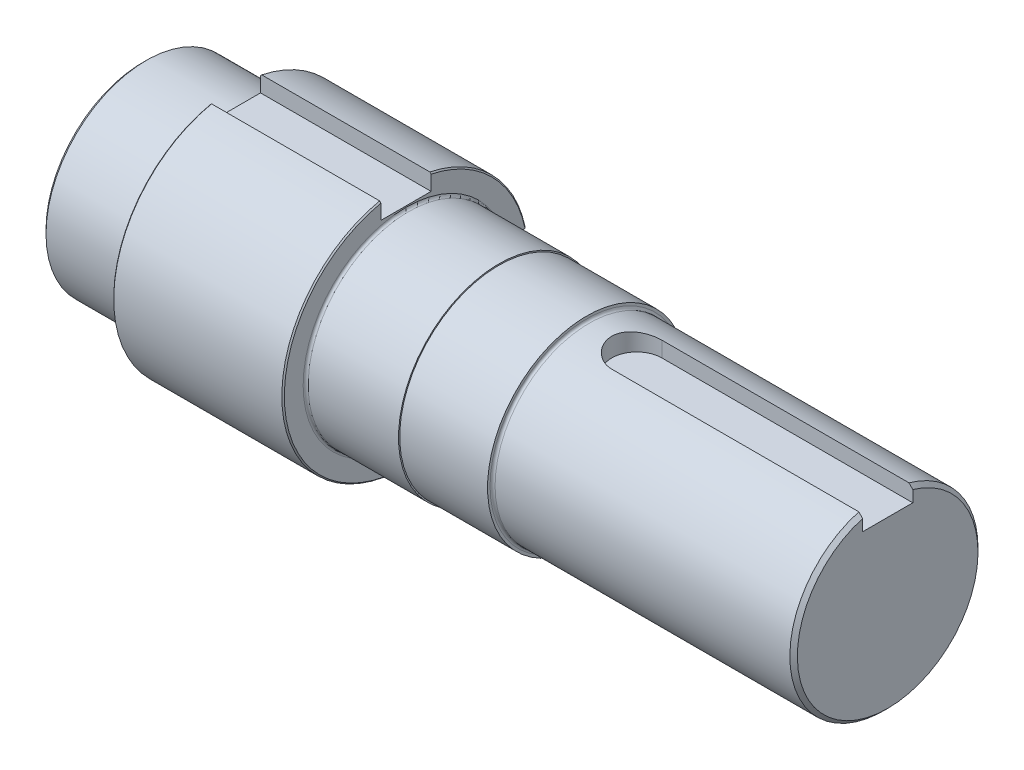
ISO-10303-21;
HEADER;
FILE_DESCRIPTION(('STEP AP214'),'2;1');
FILE_NAME('part.step','',(''),(''),'','','');
FILE_SCHEMA(('AUTOMOTIVE_DESIGN { 1 0 10303 214 1 1 1 1 }'));
ENDSEC;
DATA;
#1=APPLICATION_CONTEXT('core data for automotive mechanical design processes');
#2=APPLICATION_PROTOCOL_DEFINITION('international standard','automotive_design',2000,#1);
#3=PRODUCT_CONTEXT('',#1,'mechanical');
#4=PRODUCT('Part','Part','',(#3));
#5=PRODUCT_RELATED_PRODUCT_CATEGORY('part','',(#4));
#6=PRODUCT_DEFINITION_FORMATION('','',#4);
#7=PRODUCT_DEFINITION_CONTEXT('part definition',#1,'design');
#8=PRODUCT_DEFINITION('design','',#6,#7);
#9=PRODUCT_DEFINITION_SHAPE('','',#8);
#10=(LENGTH_UNIT() NAMED_UNIT(*) SI_UNIT(.MILLI.,.METRE.));
#11=(NAMED_UNIT(*) PLANE_ANGLE_UNIT() SI_UNIT($,.RADIAN.));
#12=(NAMED_UNIT(*) SI_UNIT($,.STERADIAN.) SOLID_ANGLE_UNIT());
#13=UNCERTAINTY_MEASURE_WITH_UNIT(LENGTH_MEASURE(1.E-05),#10,'distance_accuracy_value','');
#14=(GEOMETRIC_REPRESENTATION_CONTEXT(3) GLOBAL_UNCERTAINTY_ASSIGNED_CONTEXT((#13)) GLOBAL_UNIT_ASSIGNED_CONTEXT((#10,
#11,#12)) REPRESENTATION_CONTEXT('',''));
#15=CARTESIAN_POINT('',(0.,0.,0.));
#16=DIRECTION('',(0.,0.,1.));
#17=DIRECTION('',(1.,0.,0.));
#18=AXIS2_PLACEMENT_3D('',#15,#16,#17);
#19=CARTESIAN_POINT('',(0.,0.,0.));
#20=DIRECTION('',(1.,0.,0.));
#21=DIRECTION('',(0.,0.,-1.));
#22=AXIS2_PLACEMENT_3D('',#19,#20,#21);
#23=CYLINDRICAL_SURFACE('',#22,49.);
#24=DIRECTION('',(-1.,0.,0.));
#25=VECTOR('',#24,1.);
#26=CARTESIAN_POINT('',(126.360009363294,47.9687398208458,-10.));
#27=LINE('',#26,#25);
#28=CARTESIAN_POINT('',(104.5,47.9687398208458,-10.));
#29=VERTEX_POINT('',#28);
#30=CARTESIAN_POINT('',(37.5,47.9687398208458,-10.));
#31=VERTEX_POINT('',#30);
#32=EDGE_CURVE('E246',#29,#31,#27,.T.);
#33=ORIENTED_EDGE('',*,*,#32,.F.);
#34=CARTESIAN_POINT('',(104.5,0.,0.));
#35=DIRECTION('',(1.,0.,0.));
#36=DIRECTION('',(0.,0.,-1.));
#37=AXIS2_PLACEMENT_3D('',#34,#35,#36);
#38=CIRCLE('',#37,49.);
#39=CARTESIAN_POINT('',(104.5,10.,-47.9687398208458));
#40=VERTEX_POINT('',#39);
#41=EDGE_CURVE('E399',#29,#40,#38,.F.);
#42=ORIENTED_EDGE('',*,*,#41,.T.);
#43=DIRECTION('',(-1.,0.,0.));
#44=VECTOR('',#43,1.);
#45=CARTESIAN_POINT('',(126.360009363294,10.,-47.9687398208458));
#46=LINE('',#45,#44);
#47=CARTESIAN_POINT('',(37.5,10.,-47.9687398208458));
#48=VERTEX_POINT('',#47);
#49=EDGE_CURVE('E211',#40,#48,#46,.T.);
#50=ORIENTED_EDGE('',*,*,#49,.T.);
#51=CARTESIAN_POINT('',(37.5000000000001,0.,0.));
#52=DIRECTION('',(-1.,0.,0.));
#53=DIRECTION('',(0.,0.,1.));
#54=AXIS2_PLACEMENT_3D('',#51,#52,#53);
#55=CIRCLE('',#54,49.);
#56=EDGE_CURVE('E402',#48,#31,#55,.F.);
#57=ORIENTED_EDGE('',*,*,#56,.T.);
#58=EDGE_LOOP('',(#33,#42,#50,#57));
#59=FACE_BOUND('',#58,.T.);
#60=ADVANCED_FACE('F36',(#59),#23,.T.);
#61=CARTESIAN_POINT('',(0.,0.,0.));
#62=DIRECTION('',(1.,0.,0.));
#63=DIRECTION('',(0.,0.,-1.));
#64=AXIS2_PLACEMENT_3D('',#61,#62,#63);
#65=CYLINDRICAL_SURFACE('',#64,40.);
#66=CARTESIAN_POINT('',(106.,0.,0.));
#67=DIRECTION('',(1.,0.,0.));
#68=DIRECTION('',(0.,0.,-1.));
#69=AXIS2_PLACEMENT_3D('',#66,#67,#68);
#70=CIRCLE('',#69,40.);
#71=CARTESIAN_POINT('',(106.,0.,-40.));
#72=VERTEX_POINT('',#71);
#73=EDGE_CURVE('E267',#72,#72,#70,.T.);
#74=ORIENTED_EDGE('',*,*,#73,.T.);
#75=EDGE_LOOP('',(#74));
#76=FACE_BOUND('',#75,.T.);
#77=CARTESIAN_POINT('',(142.,0.,0.));
#78=DIRECTION('',(1.,0.,0.));
#79=DIRECTION('',(0.,0.,-1.));
#80=AXIS2_PLACEMENT_3D('',#77,#78,#79);
#81=CIRCLE('',#80,40.);
#82=CARTESIAN_POINT('',(142.,0.,-40.));
#83=VERTEX_POINT('',#82);
#84=EDGE_CURVE('E258',#83,#83,#81,.T.);
#85=ORIENTED_EDGE('',*,*,#84,.F.);
#86=EDGE_LOOP('',(#85));
#87=FACE_BOUND('',#86,.T.);
#88=ADVANCED_FACE('F388',(#76,#87),#65,.T.);
#89=CARTESIAN_POINT('',(142.,39.5,0.));
#90=DIRECTION('',(1.,0.,0.));
#91=DIRECTION('',(0.,0.,-1.));
#92=AXIS2_PLACEMENT_3D('',#89,#90,#91);
#93=PLANE('',#92);
#94=ORIENTED_EDGE('',*,*,#84,.T.);
#95=EDGE_LOOP('',(#94));
#96=FACE_BOUND('',#95,.T.);
#97=CARTESIAN_POINT('',(142.,0.,0.));
#98=DIRECTION('',(1.,0.,0.));
#99=DIRECTION('',(0.,0.,-1.));
#100=AXIS2_PLACEMENT_3D('',#97,#98,#99);
#101=CIRCLE('',#100,39.5);
#102=CARTESIAN_POINT('',(142.,0.,-39.5));
#103=VERTEX_POINT('',#102);
#104=EDGE_CURVE('E255',#103,#103,#101,.T.);
#105=ORIENTED_EDGE('',*,*,#104,.F.);
#106=EDGE_LOOP('',(#105));
#107=FACE_BOUND('',#106,.T.);
#108=ADVANCED_FACE('F393',(#96,#107),#93,.T.);
#109=CARTESIAN_POINT('',(0.,0.,0.));
#110=DIRECTION('',(1.,0.,0.));
#111=DIRECTION('',(0.,0.,-1.));
#112=AXIS2_PLACEMENT_3D('',#109,#110,#111);
#113=CYLINDRICAL_SURFACE('',#112,39.5);
#114=ORIENTED_EDGE('',*,*,#104,.T.);
#115=EDGE_LOOP('',(#114));
#116=FACE_BOUND('',#115,.T.);
#117=CARTESIAN_POINT('',(177.,0.,0.));
#118=DIRECTION('',(1.,0.,0.));
#119=DIRECTION('',(0.,0.,-1.));
#120=AXIS2_PLACEMENT_3D('',#117,#118,#119);
#121=CIRCLE('',#120,39.5);
#122=CARTESIAN_POINT('',(177.,0.,-39.5));
#123=VERTEX_POINT('',#122);
#124=EDGE_CURVE('E252',#123,#123,#121,.T.);
#125=ORIENTED_EDGE('',*,*,#124,.F.);
#126=EDGE_LOOP('',(#125));
#127=FACE_BOUND('',#126,.T.);
#128=ADVANCED_FACE('F714',(#116,#127),#113,.T.);
#129=CARTESIAN_POINT('',(177.,37.5,0.));
#130=DIRECTION('',(1.,0.,0.));
#131=DIRECTION('',(0.,0.,-1.));
#132=AXIS2_PLACEMENT_3D('',#129,#130,#131);
#133=PLANE('',#132);
#134=CARTESIAN_POINT('',(177.,0.,0.));
#135=DIRECTION('',(1.,0.,0.));
#136=DIRECTION('',(0.,0.,-1.));
#137=AXIS2_PLACEMENT_3D('',#134,#135,#136);
#138=CIRCLE('',#137,38.5);
#139=CARTESIAN_POINT('',(177.,0.,-38.5));
#140=VERTEX_POINT('',#139);
#141=EDGE_CURVE('E264',#140,#140,#138,.F.);
#142=ORIENTED_EDGE('',*,*,#141,.T.);
#143=EDGE_LOOP('',(#142));
#144=FACE_BOUND('',#143,.T.);
#145=ORIENTED_EDGE('',*,*,#124,.T.);
#146=EDGE_LOOP('',(#145));
#147=FACE_BOUND('',#146,.T.);
#148=ADVANCED_FACE('F385',(#144,#147),#133,.T.);
#149=CARTESIAN_POINT('',(0.,0.,0.));
#150=DIRECTION('',(1.,0.,0.));
#151=DIRECTION('',(0.,0.,-1.));
#152=AXIS2_PLACEMENT_3D('',#149,#150,#151);
#153=CYLINDRICAL_SURFACE('',#152,37.5);
#154=DIRECTION('',(1.,0.,0.));
#155=VECTOR('',#154,1.);
#156=CARTESIAN_POINT('',(0.,36.1420807370024,-9.99999999999996));
#157=LINE('',#156,#155);
#158=CARTESIAN_POINT('',(295.5,36.1420807370024,-9.99999999999996));
#159=VERTEX_POINT('',#158);
#160=CARTESIAN_POINT('',(197.,36.1420807370024,-9.99999999999999));
#161=VERTEX_POINT('',#160);
#162=EDGE_CURVE('E194',#159,#161,#157,.F.);
#163=ORIENTED_EDGE('',*,*,#162,.F.);
#164=CARTESIAN_POINT('',(295.5,0.,0.));
#165=DIRECTION('',(1.,0.,0.));
#166=DIRECTION('',(0.,0.,-1.));
#167=AXIS2_PLACEMENT_3D('',#164,#165,#166);
#168=CIRCLE('',#167,37.5);
#169=CARTESIAN_POINT('',(295.5,36.1420807370024,10.));
#170=VERTEX_POINT('',#169);
#171=EDGE_CURVE('E314',#159,#170,#168,.F.);
#172=ORIENTED_EDGE('',*,*,#171,.T.);
#173=DIRECTION('',(1.,0.,0.));
#174=VECTOR('',#173,1.);
#175=CARTESIAN_POINT('',(0.,36.1420807370024,10.));
#176=LINE('',#175,#174);
#177=CARTESIAN_POINT('',(197.,36.1420807370024,10.));
#178=VERTEX_POINT('',#177);
#179=EDGE_CURVE('E196',#178,#170,#176,.T.);
#180=ORIENTED_EDGE('',*,*,#179,.F.);
#181=CARTESIAN_POINT('',(197.,36.1420807370024,-9.99999999999999));
#182=CARTESIAN_POINT('',(196.724109580161,36.1420464078998,-10.0000357292068));
#183=CARTESIAN_POINT('',(196.448231289096,36.1452385899087,-9.98858427588763));
#184=CARTESIAN_POINT('',(195.89855077144,36.1578258631696,-9.94297036791714));
#185=CARTESIAN_POINT('',(195.624748168825,36.1672198023945,-9.90881213122839));
#186=CARTESIAN_POINT('',(195.081751041847,36.1919340616184,-9.81814538046824));
#187=CARTESIAN_POINT('',(194.812547878144,36.2072416006051,-9.76168506181857));
#188=CARTESIAN_POINT('',(194.280044751028,36.2433115177211,-9.62690315126375));
#189=CARTESIAN_POINT('',(194.016744891385,36.2640739916563,-9.54858117539717));
#190=CARTESIAN_POINT('',(193.497963434292,36.310432607492,-9.37074735142767));
#191=CARTESIAN_POINT('',(193.242478763069,36.3360268198731,-9.27124395995133));
#192=CARTESIAN_POINT('',(192.740816318043,36.3913240032593,-9.0517591305609));
#193=CARTESIAN_POINT('',(192.494642029144,36.4210284937471,-8.9317701156924));
#194=CARTESIAN_POINT('',(192.013255101169,36.483703978747,-8.67220622808559));
#195=CARTESIAN_POINT('',(191.778043502493,36.5166752823667,-8.53262950142499));
#196=CARTESIAN_POINT('',(191.320065316873,36.5849747080548,-8.23486192353356));
#197=CARTESIAN_POINT('',(191.097299320463,36.6203029417832,-8.0766701901413));
#198=CARTESIAN_POINT('',(190.660745221661,36.6931709241147,-7.7389728241952));
#199=CARTESIAN_POINT('',(190.447270603198,36.7307425043483,-7.55906868161431));
#200=CARTESIAN_POINT('',(190.036140314026,36.8063106079019,-7.18209204498552));
#201=CARTESIAN_POINT('',(189.838484840281,36.8443071365063,-6.98501933723536));
#202=CARTESIAN_POINT('',(189.460244692898,36.9196905411044,-6.57494551032973));
#203=CARTESIAN_POINT('',(189.279663030315,36.9570773086053,-6.3619415934425));
#204=CARTESIAN_POINT('',(188.9368237998,37.0302140865339,-5.92140941579437));
#205=CARTESIAN_POINT('',(188.774565725317,37.0659641421919,-5.69388155681757));
#206=CARTESIAN_POINT('',(188.467012763976,37.1354151265182,-5.22194772964424));
#207=CARTESIAN_POINT('',(188.322037002851,37.1690732259786,-4.97732730629987));
#208=CARTESIAN_POINT('',(188.053322122913,37.2327275986786,-4.47635102900577));
#209=CARTESIAN_POINT('',(187.929574826507,37.2627252806867,-4.21999974242455));
#210=CARTESIAN_POINT('',(187.704231844848,37.3182177108351,-3.69725626055352));
#211=CARTESIAN_POINT('',(187.602636656251,37.343712358014,-3.43086384029647));
#212=CARTESIAN_POINT('',(187.422457285678,37.3894600616908,-2.88996997239695));
#213=CARTESIAN_POINT('',(187.343872489977,37.4097132579855,-2.61546874124524));
#214=CARTESIAN_POINT('',(187.211930792226,37.4439892813542,-2.06675899825413));
#215=CARTESIAN_POINT('',(187.158037518929,37.4581441293493,-1.79268765664309));
#216=CARTESIAN_POINT('',(187.073345761489,37.4804854751872,-1.24075807295075));
#217=CARTESIAN_POINT('',(187.042546959115,37.4886720552701,-0.962899883104336));
#218=CARTESIAN_POINT('',(187.004321021235,37.4988434216324,-0.40550159586185));
#219=CARTESIAN_POINT('',(186.996890996296,37.5008289746379,-0.125961710681724));
#220=CARTESIAN_POINT('',(187.005461824091,37.4985436408736,0.432730809167664));
#221=CARTESIAN_POINT('',(187.021462343197,37.4942728431882,0.711883449294261));
#222=CARTESIAN_POINT('',(187.076049213136,37.4797829722753,1.26067916345435));
#223=CARTESIAN_POINT('',(187.11405469268,37.4697169154262,1.53038430263444));
#224=CARTESIAN_POINT('',(187.211867013415,37.4440291977852,2.06553606430039));
#225=CARTESIAN_POINT('',(187.271673424228,37.4284076466657,2.330982770745));
#226=CARTESIAN_POINT('',(187.41258697893,37.392029375576,2.8557506742573));
#227=CARTESIAN_POINT('',(187.493690762171,37.3712734658187,3.11507283072599));
#228=CARTESIAN_POINT('',(187.676599035346,37.3251654473813,3.62599635027782));
#229=CARTESIAN_POINT('',(187.778411408059,37.2998115888792,3.87759473118544));
#230=CARTESIAN_POINT('',(188.003017022608,37.2449155825348,4.37368739032749));
#231=CARTESIAN_POINT('',(188.126000823171,37.2153358506386,4.61809120496431));
#232=CARTESIAN_POINT('',(188.391426987731,37.1529391754153,5.09579934776974));
#233=CARTESIAN_POINT('',(188.533878022939,37.120120791329,5.32909866691677));
#234=CARTESIAN_POINT('',(188.837230312776,37.0521114662818,5.78305513059358));
#235=CARTESIAN_POINT('',(188.998134124893,37.0169201967268,6.00371051634858));
#236=CARTESIAN_POINT('',(189.337238327655,36.9451008423901,6.43089618469818));
#237=CARTESIAN_POINT('',(189.515431509723,36.908473360182,6.63743229343563));
#238=CARTESIAN_POINT('',(189.893825919373,36.8335752772454,7.04139450300014));
#239=CARTESIAN_POINT('',(190.094538499103,36.7952889587408,7.23833901920319));
#240=CARTESIAN_POINT('',(190.511816228357,36.7192656116191,7.61461578180042));
#241=CARTESIAN_POINT('',(190.728376119787,36.6815284057456,7.79395382414292));
#242=CARTESIAN_POINT('',(191.176108180447,36.6076351870052,8.13396192065507));
#243=CARTESIAN_POINT('',(191.407287215786,36.5714799308171,8.29462310088236));
#244=CARTESIAN_POINT('',(191.882647906683,36.5018085519219,8.59604030584105));
#245=CARTESIAN_POINT('',(192.126829157173,36.4682923470792,8.73679695017294));
#246=CARTESIAN_POINT('',(192.62827291943,36.4046665265359,8.99824931389014));
#247=CARTESIAN_POINT('',(192.885612847947,36.3745815286058,9.11880266131591));
#248=CARTESIAN_POINT('',(193.410037909002,36.3190013881785,9.33771387734027));
#249=CARTESIAN_POINT('',(193.677122589376,36.2935060330431,9.43607277426154));
#250=CARTESIAN_POINT('',(194.218793887547,36.2479292678768,9.60966597387252));
#251=CARTESIAN_POINT('',(194.493370949454,36.2278412868434,9.68492835900351));
#252=CARTESIAN_POINT('',(195.048189298258,36.1936864864819,9.81179739177894));
#253=CARTESIAN_POINT('',(195.328427881519,36.1796168611108,9.8634150645079));
#254=CARTESIAN_POINT('',(195.840627296984,36.1599403902555,9.93528426256658));
#255=CARTESIAN_POINT('',(196.071990983118,36.1532531846,9.9595578962168));
#256=CARTESIAN_POINT('',(196.535563515365,36.1443187338773,9.99191060647353));
#257=CARTESIAN_POINT('',(196.767770440053,36.1420644665661,10.0000152966961));
#258=CARTESIAN_POINT('',(197.,36.1420807370024,10.));
#259=B_SPLINE_CURVE_WITH_KNOTS('',3,(#181,#182,#183,#184,#185,#186,#187,#188,#189,#190,#191,
#192,#193,#194,#195,#196,#197,#198,#199,#200,#201,#202,#203,#204,#205,#206,#207,#208,#209,#210,
#211,#212,#213,#214,#215,#216,#217,#218,#219,#220,#221,#222,#223,#224,#225,#226,#227,#228,#229,
#230,#231,#232,#233,#234,#235,#236,#237,#238,#239,#240,#241,#242,#243,#244,#245,#246,#247,#248,
#249,#250,#251,#252,#253,#254,#255,#256,#257,#258),.UNSPECIFIED.,.F.,.F.,(4,2,2,2,2,2,2,2,2,2,2,
2,2,2,2,2,2,2,2,2,2,2,2,2,2,2,2,2,2,2,2,2,2,2,2,2,2,2,4),(0.,0.82739667720715,1.65463970194511,
2.48010472674528,3.30558425029439,4.13073481929066,4.95619124799432,5.78172585660433,
6.6072996029008,7.45139249583392,8.29549589694507,9.13974788345452,9.98397652505239,
10.8419477067802,11.6995876364548,12.5572467926149,13.4148830714667,14.2528849064268,
15.0908751938641,15.9287618638903,16.7666366033561,17.5833414778182,18.4000302303867,
19.2165901898355,20.0334615586869,20.8581116085197,21.6831301834462,22.5082632414953,
23.3330537374982,24.1834388191918,25.033543013737,25.8840494817974,26.7345294689446,
27.5907713950964,28.4469736413351,29.3021306910175,30.1568885901507,30.8544880754665,
31.5509815962113),.UNSPECIFIED.);
#260=EDGE_CURVE('E172',#161,#178,#259,.T.);
#261=ORIENTED_EDGE('',*,*,#260,.F.);
#262=EDGE_LOOP('',(#163,#172,#180,#261));
#263=FACE_BOUND('',#262,.T.);
#264=CARTESIAN_POINT('',(178.,0.,0.));
#265=DIRECTION('',(1.,0.,0.));
#266=DIRECTION('',(0.,0.,-1.));
#267=AXIS2_PLACEMENT_3D('',#264,#265,#266);
#268=CIRCLE('',#267,37.5);
#269=CARTESIAN_POINT('',(178.,0.,-37.5));
#270=VERTEX_POINT('',#269);
#271=EDGE_CURVE('E261',#270,#270,#268,.T.);
#272=ORIENTED_EDGE('',*,*,#271,.T.);
#273=EDGE_LOOP('',(#272));
#274=FACE_BOUND('',#273,.T.);
#275=ADVANCED_FACE('F287',(#263,#274),#153,.T.);
#276=CARTESIAN_POINT('',(297.,0.,0.));
#277=DIRECTION('',(1.,0.,0.));
#278=DIRECTION('',(0.,0.,-1.));
#279=AXIS2_PLACEMENT_3D('',#276,#277,#278);
#280=PLANE('',#279);
#281=DIRECTION('',(0.,1.,0.));
#282=VECTOR('',#281,1.);
#283=CARTESIAN_POINT('',(297.,30.,10.));
#284=LINE('',#283,#282);
#285=CARTESIAN_POINT('',(297.,30.,10.));
#286=VERTEX_POINT('',#285);
#287=CARTESIAN_POINT('',(297.,34.5832329315812,10.));
#288=VERTEX_POINT('',#287);
#289=EDGE_CURVE('E197',#286,#288,#284,.T.);
#290=ORIENTED_EDGE('',*,*,#289,.T.);
#291=CARTESIAN_POINT('',(297.,0.,0.));
#292=DIRECTION('',(1.,0.,0.));
#293=DIRECTION('',(0.,0.,-1.));
#294=AXIS2_PLACEMENT_3D('',#291,#292,#293);
#295=CIRCLE('',#294,36.);
#296=CARTESIAN_POINT('',(297.,34.5832329315812,-10.));
#297=VERTEX_POINT('',#296);
#298=EDGE_CURVE('E187',#288,#297,#295,.T.);
#299=ORIENTED_EDGE('',*,*,#298,.T.);
#300=DIRECTION('',(0.,1.,0.));
#301=VECTOR('',#300,1.);
#302=CARTESIAN_POINT('',(297.,30.,-10.));
#303=LINE('',#302,#301);
#304=CARTESIAN_POINT('',(297.,30.,-10.));
#305=VERTEX_POINT('',#304);
#306=EDGE_CURVE('E178',#305,#297,#303,.T.);
#307=ORIENTED_EDGE('',*,*,#306,.F.);
#308=DIRECTION('',(0.,0.,-1.));
#309=VECTOR('',#308,1.);
#310=CARTESIAN_POINT('',(297.,30.,0.));
#311=LINE('',#310,#309);
#312=EDGE_CURVE('E161',#286,#305,#311,.T.);
#313=ORIENTED_EDGE('',*,*,#312,.F.);
#314=EDGE_LOOP('',(#290,#299,#307,#313));
#315=FACE_BOUND('',#314,.T.);
#316=ADVANCED_FACE('F185',(#315),#280,.T.);
#317=CARTESIAN_POINT('',(0.,40.,0.));
#318=DIRECTION('',(-1.,0.,0.));
#319=DIRECTION('',(0.,0.,1.));
#320=AXIS2_PLACEMENT_3D('',#317,#318,#319);
#321=PLANE('',#320);
#322=CARTESIAN_POINT('',(0.,0.,0.));
#323=DIRECTION('',(-1.,0.,0.));
#324=DIRECTION('',(0.,0.,1.));
#325=AXIS2_PLACEMENT_3D('',#322,#323,#324);
#326=CIRCLE('',#325,38.5);
#327=CARTESIAN_POINT('',(0.,0.,38.5));
#328=VERTEX_POINT('',#327);
#329=EDGE_CURVE('E776',#328,#328,#326,.T.);
#330=ORIENTED_EDGE('',*,*,#329,.T.);
#331=EDGE_LOOP('',(#330));
#332=FACE_BOUND('',#331,.T.);
#333=ADVANCED_FACE('F377',(#332),#321,.T.);
#334=CARTESIAN_POINT('',(0.,0.,0.));
#335=DIRECTION('',(1.,0.,0.));
#336=DIRECTION('',(0.,0.,-1.));
#337=AXIS2_PLACEMENT_3D('',#334,#335,#336);
#338=CYLINDRICAL_SURFACE('',#337,40.);
#339=CARTESIAN_POINT('',(1.5,0.,0.));
#340=DIRECTION('',(-1.,0.,0.));
#341=DIRECTION('',(0.,0.,1.));
#342=AXIS2_PLACEMENT_3D('',#339,#340,#341);
#343=CIRCLE('',#342,40.);
#344=CARTESIAN_POINT('',(1.5,0.,40.));
#345=VERTEX_POINT('',#344);
#346=EDGE_CURVE('E285',#345,#345,#343,.F.);
#347=ORIENTED_EDGE('',*,*,#346,.T.);
#348=EDGE_LOOP('',(#347));
#349=FACE_BOUND('',#348,.T.);
#350=CARTESIAN_POINT('',(36.,0.,0.));
#351=DIRECTION('',(-1.,0.,0.));
#352=DIRECTION('',(0.,0.,1.));
#353=AXIS2_PLACEMENT_3D('',#350,#351,#352);
#354=CIRCLE('',#353,40.);
#355=CARTESIAN_POINT('',(36.,0.,40.));
#356=VERTEX_POINT('',#355);
#357=EDGE_CURVE('E173',#356,#356,#354,.T.);
#358=ORIENTED_EDGE('',*,*,#357,.T.);
#359=EDGE_LOOP('',(#358));
#360=FACE_BOUND('',#359,.T.);
#361=ADVANCED_FACE('F373',(#349,#360),#338,.T.);
#362=CARTESIAN_POINT('',(37.,49.,0.));
#363=DIRECTION('',(-1.,0.,0.));
#364=DIRECTION('',(0.,0.,1.));
#365=AXIS2_PLACEMENT_3D('',#362,#363,#364);
#366=PLANE('',#365);
#367=CARTESIAN_POINT('',(37.,0.,0.));
#368=DIRECTION('',(-1.,0.,0.));
#369=DIRECTION('',(0.,0.,1.));
#370=AXIS2_PLACEMENT_3D('',#367,#368,#369);
#371=CIRCLE('',#370,41.);
#372=CARTESIAN_POINT('',(37.,0.,41.));
#373=VERTEX_POINT('',#372);
#374=EDGE_CURVE('E273',#373,#373,#371,.F.);
#375=ORIENTED_EDGE('',*,*,#374,.T.);
#376=EDGE_LOOP('',(#375));
#377=FACE_BOUND('',#376,.T.);
#378=DIRECTION('',(0.,-1.,0.));
#379=VECTOR('',#378,1.);
#380=CARTESIAN_POINT('',(37.,47.9687398208458,-10.));
#381=LINE('',#380,#379);
#382=CARTESIAN_POINT('',(37.,47.4578760586691,-10.));
#383=VERTEX_POINT('',#382);
#384=CARTESIAN_POINT('',(37.,41.5,-10.));
#385=VERTEX_POINT('',#384);
#386=EDGE_CURVE('E227',#383,#385,#381,.T.);
#387=ORIENTED_EDGE('',*,*,#386,.F.);
#388=CARTESIAN_POINT('',(37.,0.,0.));
#389=DIRECTION('',(-1.,0.,0.));
#390=DIRECTION('',(0.,0.,1.));
#391=AXIS2_PLACEMENT_3D('',#388,#389,#390);
#392=CIRCLE('',#391,48.5);
#393=CARTESIAN_POINT('',(37.,10.,-47.4578760586691));
#394=VERTEX_POINT('',#393);
#395=EDGE_CURVE('E465',#383,#394,#392,.T.);
#396=ORIENTED_EDGE('',*,*,#395,.T.);
#397=DIRECTION('',(0.,0.,-1.));
#398=VECTOR('',#397,1.);
#399=CARTESIAN_POINT('',(37.,10.,-47.9687398208458));
#400=LINE('',#399,#398);
#401=CARTESIAN_POINT('',(37.,10.,-41.5));
#402=VERTEX_POINT('',#401);
#403=EDGE_CURVE('E204',#402,#394,#400,.T.);
#404=ORIENTED_EDGE('',*,*,#403,.F.);
#405=DIRECTION('',(0.,1.,0.));
#406=VECTOR('',#405,1.);
#407=CARTESIAN_POINT('',(37.,10.,-41.5));
#408=LINE('',#407,#406);
#409=CARTESIAN_POINT('',(37.,-10.,-41.5));
#410=VERTEX_POINT('',#409);
#411=EDGE_CURVE('E200',#410,#402,#408,.T.);
#412=ORIENTED_EDGE('',*,*,#411,.F.);
#413=DIRECTION('',(0.,0.,1.));
#414=VECTOR('',#413,1.);
#415=CARTESIAN_POINT('',(37.,-10.,-41.5));
#416=LINE('',#415,#414);
#417=CARTESIAN_POINT('',(37.,-10.,-47.4578760586691));
#418=VERTEX_POINT('',#417);
#419=EDGE_CURVE('E201',#418,#410,#416,.T.);
#420=ORIENTED_EDGE('',*,*,#419,.F.);
#421=CARTESIAN_POINT('',(37.,0.,0.));
#422=DIRECTION('',(-1.,0.,0.));
#423=DIRECTION('',(0.,0.,1.));
#424=AXIS2_PLACEMENT_3D('',#421,#422,#423);
#425=CIRCLE('',#424,48.5);
#426=CARTESIAN_POINT('',(37.,47.4578760586691,10.));
#427=VERTEX_POINT('',#426);
#428=EDGE_CURVE('E462',#418,#427,#425,.T.);
#429=ORIENTED_EDGE('',*,*,#428,.T.);
#430=DIRECTION('',(0.,1.,0.));
#431=VECTOR('',#430,1.);
#432=CARTESIAN_POINT('',(37.,41.5,10.));
#433=LINE('',#432,#431);
#434=CARTESIAN_POINT('',(37.,41.5,10.));
#435=VERTEX_POINT('',#434);
#436=EDGE_CURVE('E228',#435,#427,#433,.T.);
#437=ORIENTED_EDGE('',*,*,#436,.F.);
#438=DIRECTION('',(0.,0.,1.));
#439=VECTOR('',#438,1.);
#440=CARTESIAN_POINT('',(37.,41.5,-10.));
#441=LINE('',#440,#439);
#442=EDGE_CURVE('E231',#385,#435,#441,.T.);
#443=ORIENTED_EDGE('',*,*,#442,.F.);
#444=EDGE_LOOP('',(#387,#396,#404,#412,#420,#429,#437,#443));
#445=FACE_BOUND('',#444,.T.);
#446=ADVANCED_FACE('F370',(#377,#445),#366,.T.);
#447=DIRECTION('',(-1.,0.,0.));
#448=VECTOR('',#447,1.);
#449=CARTESIAN_POINT('',(126.360009363294,47.9687398208458,10.));
#450=LINE('',#449,#448);
#451=CARTESIAN_POINT('',(104.5,47.9687398208458,10.));
#452=VERTEX_POINT('',#451);
#453=CARTESIAN_POINT('',(37.5,47.9687398208458,10.));
#454=VERTEX_POINT('',#453);
#455=EDGE_CURVE('E240',#452,#454,#450,.T.);
#456=ORIENTED_EDGE('',*,*,#455,.T.);
#457=CARTESIAN_POINT('',(37.5,0.,0.));
#458=DIRECTION('',(-1.,0.,0.));
#459=DIRECTION('',(0.,0.,1.));
#460=AXIS2_PLACEMENT_3D('',#457,#458,#459);
#461=CIRCLE('',#460,49.);
#462=CARTESIAN_POINT('',(37.5,-10.,-47.9687398208458));
#463=VERTEX_POINT('',#462);
#464=EDGE_CURVE('E464',#454,#463,#461,.F.);
#465=ORIENTED_EDGE('',*,*,#464,.T.);
#466=DIRECTION('',(-1.,0.,0.));
#467=VECTOR('',#466,1.);
#468=CARTESIAN_POINT('',(126.360009363294,-10.,-47.9687398208458));
#469=LINE('',#468,#467);
#470=CARTESIAN_POINT('',(104.5,-10.,-47.9687398208458));
#471=VERTEX_POINT('',#470);
#472=EDGE_CURVE('E219',#471,#463,#469,.T.);
#473=ORIENTED_EDGE('',*,*,#472,.F.);
#474=CARTESIAN_POINT('',(104.5,0.,0.));
#475=DIRECTION('',(1.,0.,0.));
#476=DIRECTION('',(0.,0.,-1.));
#477=AXIS2_PLACEMENT_3D('',#474,#475,#476);
#478=CIRCLE('',#477,49.);
#479=EDGE_CURVE('E62',#471,#452,#478,.F.);
#480=ORIENTED_EDGE('',*,*,#479,.T.);
#481=EDGE_LOOP('',(#456,#465,#473,#480));
#482=FACE_BOUND('',#481,.T.);
#483=ADVANCED_FACE('F366',(#482),#23,.T.);
#484=CARTESIAN_POINT('',(105.,40.,0.));
#485=DIRECTION('',(1.,0.,0.));
#486=DIRECTION('',(0.,0.,-1.));
#487=AXIS2_PLACEMENT_3D('',#484,#485,#486);
#488=PLANE('',#487);
#489=CARTESIAN_POINT('',(105.,0.,0.));
#490=DIRECTION('',(1.,0.,0.));
#491=DIRECTION('',(0.,0.,-1.));
#492=AXIS2_PLACEMENT_3D('',#489,#490,#491);
#493=CIRCLE('',#492,41.);
#494=CARTESIAN_POINT('',(105.,0.,-41.));
#495=VERTEX_POINT('',#494);
#496=EDGE_CURVE('E270',#495,#495,#493,.F.);
#497=ORIENTED_EDGE('',*,*,#496,.T.);
#498=EDGE_LOOP('',(#497));
#499=FACE_BOUND('',#498,.T.);
#500=DIRECTION('',(0.,0.,-1.));
#501=VECTOR('',#500,1.);
#502=CARTESIAN_POINT('',(105.,10.,-47.9687398208458));
#503=LINE('',#502,#501);
#504=CARTESIAN_POINT('',(105.,10.,-41.5));
#505=VERTEX_POINT('',#504);
#506=CARTESIAN_POINT('',(105.,10.,-47.4578760586691));
#507=VERTEX_POINT('',#506);
#508=EDGE_CURVE('E203',#505,#507,#503,.T.);
#509=ORIENTED_EDGE('',*,*,#508,.T.);
#510=CARTESIAN_POINT('',(105.,0.,0.));
#511=DIRECTION('',(1.,0.,0.));
#512=DIRECTION('',(0.,0.,-1.));
#513=AXIS2_PLACEMENT_3D('',#510,#511,#512);
#514=CIRCLE('',#513,48.5);
#515=CARTESIAN_POINT('',(105.,47.4578760586691,-10.));
#516=VERTEX_POINT('',#515);
#517=EDGE_CURVE('E337',#507,#516,#514,.T.);
#518=ORIENTED_EDGE('',*,*,#517,.T.);
#519=DIRECTION('',(0.,-1.,0.));
#520=VECTOR('',#519,1.);
#521=CARTESIAN_POINT('',(105.,47.9687398208458,-10.));
#522=LINE('',#521,#520);
#523=CARTESIAN_POINT('',(105.,41.5,-10.));
#524=VERTEX_POINT('',#523);
#525=EDGE_CURVE('E230',#516,#524,#522,.T.);
#526=ORIENTED_EDGE('',*,*,#525,.T.);
#527=DIRECTION('',(0.,0.,1.));
#528=VECTOR('',#527,1.);
#529=CARTESIAN_POINT('',(105.,41.5,-10.));
#530=LINE('',#529,#528);
#531=CARTESIAN_POINT('',(105.,41.5,10.));
#532=VERTEX_POINT('',#531);
#533=EDGE_CURVE('E242',#524,#532,#530,.T.);
#534=ORIENTED_EDGE('',*,*,#533,.T.);
#535=DIRECTION('',(0.,1.,0.));
#536=VECTOR('',#535,1.);
#537=CARTESIAN_POINT('',(105.,41.5,10.));
#538=LINE('',#537,#536);
#539=CARTESIAN_POINT('',(105.,47.4578760586691,10.));
#540=VERTEX_POINT('',#539);
#541=EDGE_CURVE('E237',#532,#540,#538,.T.);
#542=ORIENTED_EDGE('',*,*,#541,.T.);
#543=CARTESIAN_POINT('',(105.,0.,0.));
#544=DIRECTION('',(1.,0.,0.));
#545=DIRECTION('',(0.,0.,-1.));
#546=AXIS2_PLACEMENT_3D('',#543,#544,#545);
#547=CIRCLE('',#546,48.5);
#548=CARTESIAN_POINT('',(105.,-10.,-47.4578760586691));
#549=VERTEX_POINT('',#548);
#550=EDGE_CURVE('E334',#540,#549,#547,.T.);
#551=ORIENTED_EDGE('',*,*,#550,.T.);
#552=DIRECTION('',(0.,0.,1.));
#553=VECTOR('',#552,1.);
#554=CARTESIAN_POINT('',(105.,-10.,-41.5));
#555=LINE('',#554,#553);
#556=CARTESIAN_POINT('',(105.,-10.,-41.5));
#557=VERTEX_POINT('',#556);
#558=EDGE_CURVE('E217',#549,#557,#555,.T.);
#559=ORIENTED_EDGE('',*,*,#558,.T.);
#560=DIRECTION('',(0.,1.,0.));
#561=VECTOR('',#560,1.);
#562=CARTESIAN_POINT('',(105.,10.,-41.5));
#563=LINE('',#562,#561);
#564=EDGE_CURVE('E212',#557,#505,#563,.T.);
#565=ORIENTED_EDGE('',*,*,#564,.T.);
#566=EDGE_LOOP('',(#509,#518,#526,#534,#542,#551,#559,#565));
#567=FACE_BOUND('',#566,.T.);
#568=ADVANCED_FACE('F361',(#499,#567),#488,.T.);
#569=CARTESIAN_POINT('',(126.360009363294,47.9687398208458,-10.));
#570=DIRECTION('',(0.,0.,-1.));
#571=DIRECTION('',(-1.,0.,0.));
#572=AXIS2_PLACEMENT_3D('',#569,#570,#571);
#573=PLANE('',#572);
#574=ORIENTED_EDGE('',*,*,#525,.F.);
#575=CARTESIAN_POINT('',(105.,47.4578760586691,-10.));
#576=CARTESIAN_POINT('',(104.916676254528,47.5430294030052,-10.));
#577=CARTESIAN_POINT('',(104.833347715124,47.6281780553553,-10.));
#578=CARTESIAN_POINT('',(104.666681048457,47.7984659760809,-10.));
#579=CARTESIAN_POINT('',(104.583342921194,47.8836052444563,-10.));
#580=CARTESIAN_POINT('',(104.5,47.9687398208458,-10.));
#581=B_SPLINE_CURVE_WITH_KNOTS('',3,(#575,#576,#577,#578,#579,#580),.UNSPECIFIED.,.F.,.F.,(4,2,
4),(0.,0.357414949722976,0.714829899434335),.UNSPECIFIED.);
#582=EDGE_CURVE('E347',#516,#29,#581,.T.);
#583=ORIENTED_EDGE('',*,*,#582,.T.);
#584=ORIENTED_EDGE('',*,*,#32,.T.);
#585=CARTESIAN_POINT('',(37.5000000000001,47.9687398208458,-10.));
#586=CARTESIAN_POINT('',(37.4166570788057,47.8836052444563,-10.));
#587=CARTESIAN_POINT('',(37.3333189515425,47.7984659760809,-10.));
#588=CARTESIAN_POINT('',(37.1666522848758,47.6281780553553,-10.));
#589=CARTESIAN_POINT('',(37.0833237454723,47.5430294030052,-10.));
#590=CARTESIAN_POINT('',(37.,47.4578760586691,-10.));
#591=B_SPLINE_CURVE_WITH_KNOTS('',3,(#585,#586,#587,#588,#589,#590),.UNSPECIFIED.,.F.,.F.,(4,2,
4),(0.,0.357414949711354,0.714829899434345),.UNSPECIFIED.);
#592=EDGE_CURVE('E340',#31,#383,#591,.T.);
#593=ORIENTED_EDGE('',*,*,#592,.T.);
#594=ORIENTED_EDGE('',*,*,#386,.T.);
#595=DIRECTION('',(-1.,0.,0.));
#596=VECTOR('',#595,1.);
#597=CARTESIAN_POINT('',(126.360009363294,41.5,-10.));
#598=LINE('',#597,#596);
#599=EDGE_CURVE('E236',#524,#385,#598,.T.);
#600=ORIENTED_EDGE('',*,*,#599,.F.);
#601=EDGE_LOOP('',(#574,#583,#584,#593,#594,#600));
#602=FACE_BOUND('',#601,.T.);
#603=ADVANCED_FACE('F355',(#602),#573,.F.);
#604=CARTESIAN_POINT('',(126.360009363294,41.5,-10.));
#605=DIRECTION('',(0.,-1.,0.));
#606=DIRECTION('',(0.,0.,-1.));
#607=AXIS2_PLACEMENT_3D('',#604,#605,#606);
#608=PLANE('',#607);
#609=ORIENTED_EDGE('',*,*,#599,.T.);
#610=ORIENTED_EDGE('',*,*,#442,.T.);
#611=DIRECTION('',(-1.,0.,0.));
#612=VECTOR('',#611,1.);
#613=CARTESIAN_POINT('',(126.360009363294,41.5,10.));
#614=LINE('',#613,#612);
#615=EDGE_CURVE('E241',#532,#435,#614,.T.);
#616=ORIENTED_EDGE('',*,*,#615,.F.);
#617=ORIENTED_EDGE('',*,*,#533,.F.);
#618=EDGE_LOOP('',(#609,#610,#616,#617));
#619=FACE_BOUND('',#618,.T.);
#620=ADVANCED_FACE('F360',(#619),#608,.F.);
#621=CARTESIAN_POINT('',(126.360009363294,41.5,10.));
#622=DIRECTION('',(0.,0.,1.));
#623=DIRECTION('',(1.,0.,0.));
#624=AXIS2_PLACEMENT_3D('',#621,#622,#623);
#625=PLANE('',#624);
#626=ORIENTED_EDGE('',*,*,#436,.T.);
#627=CARTESIAN_POINT('',(37.,47.4578760586691,10.));
#628=CARTESIAN_POINT('',(37.0833237454723,47.5430294030052,10.));
#629=CARTESIAN_POINT('',(37.1666522848758,47.6281780553553,10.));
#630=CARTESIAN_POINT('',(37.3333189515425,47.7984659760809,10.));
#631=CARTESIAN_POINT('',(37.4166570788057,47.8836052444563,10.));
#632=CARTESIAN_POINT('',(37.5,47.9687398208458,10.));
#633=B_SPLINE_CURVE_WITH_KNOTS('',3,(#627,#628,#629,#630,#631,#632),.UNSPECIFIED.,.F.,.F.,(4,2,
4),(0.,0.357414949722962,0.714829899434296),.UNSPECIFIED.);
#634=EDGE_CURVE('E11',#427,#454,#633,.T.);
#635=ORIENTED_EDGE('',*,*,#634,.T.);
#636=ORIENTED_EDGE('',*,*,#455,.F.);
#637=CARTESIAN_POINT('',(104.5,47.9687398208458,10.));
#638=CARTESIAN_POINT('',(104.583342921194,47.8836052444563,10.));
#639=CARTESIAN_POINT('',(104.666681048457,47.7984659760809,10.));
#640=CARTESIAN_POINT('',(104.833347715124,47.6281780553553,10.));
#641=CARTESIAN_POINT('',(104.916676254528,47.5430294030052,10.));
#642=CARTESIAN_POINT('',(105.,47.4578760586691,10.));
#643=B_SPLINE_CURVE_WITH_KNOTS('',3,(#637,#638,#639,#640,#641,#642),.UNSPECIFIED.,.F.,.F.,(4,2,
4),(0.,0.357414949711359,0.71482989943434),.UNSPECIFIED.);
#644=EDGE_CURVE('E50',#452,#540,#643,.T.);
#645=ORIENTED_EDGE('',*,*,#644,.T.);
#646=ORIENTED_EDGE('',*,*,#541,.F.);
#647=ORIENTED_EDGE('',*,*,#615,.T.);
#648=EDGE_LOOP('',(#626,#635,#636,#645,#646,#647));
#649=FACE_BOUND('',#648,.T.);
#650=ADVANCED_FACE('F425',(#649),#625,.F.);
#651=CARTESIAN_POINT('',(126.360009363294,10.,-47.9687398208458));
#652=DIRECTION('',(0.,1.,0.));
#653=DIRECTION('',(0.,0.,1.));
#654=AXIS2_PLACEMENT_3D('',#651,#652,#653);
#655=PLANE('',#654);
#656=ORIENTED_EDGE('',*,*,#49,.F.);
#657=CARTESIAN_POINT('',(104.5,10.,-47.9687398208458));
#658=CARTESIAN_POINT('',(104.583342921194,10.,-47.8836052444563));
#659=CARTESIAN_POINT('',(104.666681048457,10.,-47.7984659760809));
#660=CARTESIAN_POINT('',(104.833347715124,10.,-47.6281780553553));
#661=CARTESIAN_POINT('',(104.916676254528,10.,-47.5430294030052));
#662=CARTESIAN_POINT('',(105.,10.,-47.4578760586691));
#663=B_SPLINE_CURVE_WITH_KNOTS('',3,(#657,#658,#659,#660,#661,#662),.UNSPECIFIED.,.F.,.F.,(4,2,
4),(0.,0.357414949711354,0.71482989943434),.UNSPECIFIED.);
#664=EDGE_CURVE('E406',#40,#507,#663,.T.);
#665=ORIENTED_EDGE('',*,*,#664,.T.);
#666=ORIENTED_EDGE('',*,*,#508,.F.);
#667=DIRECTION('',(-1.,0.,0.));
#668=VECTOR('',#667,1.);
#669=CARTESIAN_POINT('',(126.360009363294,10.,-41.5));
#670=LINE('',#669,#668);
#671=EDGE_CURVE('E215',#505,#402,#670,.T.);
#672=ORIENTED_EDGE('',*,*,#671,.T.);
#673=ORIENTED_EDGE('',*,*,#403,.T.);
#674=CARTESIAN_POINT('',(37.,10.,-47.4578760586691));
#675=CARTESIAN_POINT('',(37.0833237454723,10.,-47.5430294030052));
#676=CARTESIAN_POINT('',(37.1666522848758,10.,-47.6281780553553));
#677=CARTESIAN_POINT('',(37.3333189515425,10.,-47.7984659760809));
#678=CARTESIAN_POINT('',(37.4166570788057,10.,-47.8836052444563));
#679=CARTESIAN_POINT('',(37.5000000000001,10.,-47.9687398208458));
#680=B_SPLINE_CURVE_WITH_KNOTS('',3,(#674,#675,#676,#677,#678,#679),.UNSPECIFIED.,.F.,.F.,(4,2,
4),(0.,0.357414949722991,0.714829899434345),.UNSPECIFIED.);
#681=EDGE_CURVE('E407',#394,#48,#680,.T.);
#682=ORIENTED_EDGE('',*,*,#681,.T.);
#683=EDGE_LOOP('',(#656,#665,#666,#672,#673,#682));
#684=FACE_BOUND('',#683,.T.);
#685=ADVANCED_FACE('F421',(#684),#655,.F.);
#686=CARTESIAN_POINT('',(126.360009363294,-10.,-41.5));
#687=DIRECTION('',(0.,-1.,0.));
#688=DIRECTION('',(0.,0.,-1.));
#689=AXIS2_PLACEMENT_3D('',#686,#687,#688);
#690=PLANE('',#689);
#691=ORIENTED_EDGE('',*,*,#472,.T.);
#692=CARTESIAN_POINT('',(37.5,-10.,-47.9687398208458));
#693=CARTESIAN_POINT('',(37.4166570788057,-10.,-47.8836052444563));
#694=CARTESIAN_POINT('',(37.3333189515425,-10.,-47.7984659760809));
#695=CARTESIAN_POINT('',(37.1666522848758,-10.,-47.6281780553553));
#696=CARTESIAN_POINT('',(37.0833237454723,-10.,-47.5430294030052));
#697=CARTESIAN_POINT('',(37.,-10.,-47.4578760586691));
#698=B_SPLINE_CURVE_WITH_KNOTS('',3,(#692,#693,#694,#695,#696,#697),.UNSPECIFIED.,.F.,.F.,(4,2,
4),(0.,0.357414949711334,0.714829899434296),.UNSPECIFIED.);
#699=EDGE_CURVE('E437',#463,#418,#698,.T.);
#700=ORIENTED_EDGE('',*,*,#699,.T.);
#701=ORIENTED_EDGE('',*,*,#419,.T.);
#702=DIRECTION('',(-1.,0.,0.));
#703=VECTOR('',#702,1.);
#704=CARTESIAN_POINT('',(126.360009363294,-10.,-41.5));
#705=LINE('',#704,#703);
#706=EDGE_CURVE('E216',#557,#410,#705,.T.);
#707=ORIENTED_EDGE('',*,*,#706,.F.);
#708=ORIENTED_EDGE('',*,*,#558,.F.);
#709=CARTESIAN_POINT('',(105.,-10.,-47.4578760586691));
#710=CARTESIAN_POINT('',(104.916676254528,-10.,-47.5430294030052));
#711=CARTESIAN_POINT('',(104.833347715124,-10.,-47.6281780553553));
#712=CARTESIAN_POINT('',(104.666681048457,-10.,-47.7984659760809));
#713=CARTESIAN_POINT('',(104.583342921194,-10.,-47.8836052444563));
#714=CARTESIAN_POINT('',(104.5,-10.,-47.9687398208458));
#715=B_SPLINE_CURVE_WITH_KNOTS('',3,(#709,#710,#711,#712,#713,#714),.UNSPECIFIED.,.F.,.F.,(4,2,
4),(0.,0.357414949722976,0.714829899434335),.UNSPECIFIED.);
#716=EDGE_CURVE('E443',#549,#471,#715,.T.);
#717=ORIENTED_EDGE('',*,*,#716,.T.);
#718=EDGE_LOOP('',(#691,#700,#701,#707,#708,#717));
#719=FACE_BOUND('',#718,.T.);
#720=ADVANCED_FACE('F424',(#719),#690,.F.);
#721=CARTESIAN_POINT('',(126.360009363294,10.,-41.5));
#722=DIRECTION('',(0.,0.,1.));
#723=DIRECTION('',(1.,0.,0.));
#724=AXIS2_PLACEMENT_3D('',#721,#722,#723);
#725=PLANE('',#724);
#726=ORIENTED_EDGE('',*,*,#706,.T.);
#727=ORIENTED_EDGE('',*,*,#411,.T.);
#728=ORIENTED_EDGE('',*,*,#671,.F.);
#729=ORIENTED_EDGE('',*,*,#564,.F.);
#730=EDGE_LOOP('',(#726,#727,#728,#729));
#731=FACE_BOUND('',#730,.T.);
#732=ADVANCED_FACE('F303',(#731),#725,.F.);
#733=CARTESIAN_POINT('',(178.,0.,0.));
#734=DIRECTION('',(1.,0.,0.));
#735=DIRECTION('',(0.,0.,-1.));
#736=AXIS2_PLACEMENT_3D('',#733,#734,#735);
#737=TOROIDAL_SURFACE('',#736,38.5,1.);
#738=ORIENTED_EDGE('',*,*,#141,.F.);
#739=EDGE_LOOP('',(#738));
#740=FACE_BOUND('',#739,.T.);
#741=ORIENTED_EDGE('',*,*,#271,.F.);
#742=EDGE_LOOP('',(#741));
#743=FACE_BOUND('',#742,.T.);
#744=ADVANCED_FACE('F515',(#740,#743),#737,.F.);
#745=CARTESIAN_POINT('',(106.,0.,0.));
#746=DIRECTION('',(1.,0.,0.));
#747=DIRECTION('',(0.,0.,-1.));
#748=AXIS2_PLACEMENT_3D('',#745,#746,#747);
#749=TOROIDAL_SURFACE('',#748,41.,1.);
#750=ORIENTED_EDGE('',*,*,#496,.F.);
#751=EDGE_LOOP('',(#750));
#752=FACE_BOUND('',#751,.T.);
#753=ORIENTED_EDGE('',*,*,#73,.F.);
#754=EDGE_LOOP('',(#753));
#755=FACE_BOUND('',#754,.T.);
#756=ADVANCED_FACE('F521',(#752,#755),#749,.F.);
#757=CARTESIAN_POINT('',(36.,0.,0.));
#758=DIRECTION('',(-1.,0.,0.));
#759=DIRECTION('',(0.,0.,1.));
#760=AXIS2_PLACEMENT_3D('',#757,#758,#759);
#761=TOROIDAL_SURFACE('',#760,41.,1.);
#762=ORIENTED_EDGE('',*,*,#357,.F.);
#763=EDGE_LOOP('',(#762));
#764=FACE_BOUND('',#763,.T.);
#765=ORIENTED_EDGE('',*,*,#374,.F.);
#766=EDGE_LOOP('',(#765));
#767=FACE_BOUND('',#766,.T.);
#768=ADVANCED_FACE('F529',(#764,#767),#761,.F.);
#769=CARTESIAN_POINT('',(297.,30.,10.));
#770=DIRECTION('',(0.,0.,1.));
#771=DIRECTION('',(1.,0.,0.));
#772=AXIS2_PLACEMENT_3D('',#769,#770,#771);
#773=PLANE('',#772);
#774=ORIENTED_EDGE('',*,*,#179,.T.);
#775=CARTESIAN_POINT('',(295.5,36.1420807370024,10.));
#776=CARTESIAN_POINT('',(295.750211938046,35.8824767083393,10.));
#777=CARTESIAN_POINT('',(296.000317906645,35.6227707106641,10.));
#778=CARTESIAN_POINT('',(296.500317906647,35.1031547755251,9.99999999999999));
#779=CARTESIAN_POINT('',(296.750211938048,34.8432448380599,9.99999999999999));
#780=CARTESIAN_POINT('',(297.,34.5832329315812,10.));
#781=B_SPLINE_CURVE_WITH_KNOTS('',3,(#775,#776,#777,#778,#779,#780),.UNSPECIFIED.,.F.,.F.,(4,2,
4),(0.,1.08166621784012,2.1633324430253),.UNSPECIFIED.);
#782=EDGE_CURVE('E328',#170,#288,#781,.T.);
#783=ORIENTED_EDGE('',*,*,#782,.T.);
#784=ORIENTED_EDGE('',*,*,#289,.F.);
#785=DIRECTION('',(1.,0.,0.));
#786=VECTOR('',#785,1.);
#787=CARTESIAN_POINT('',(297.,30.,10.));
#788=LINE('',#787,#786);
#789=CARTESIAN_POINT('',(197.,30.,10.));
#790=VERTEX_POINT('',#789);
#791=EDGE_CURVE('E167',#790,#286,#788,.T.);
#792=ORIENTED_EDGE('',*,*,#791,.F.);
#793=DIRECTION('',(0.,1.,0.));
#794=VECTOR('',#793,1.);
#795=CARTESIAN_POINT('',(197.,30.,10.));
#796=LINE('',#795,#794);
#797=EDGE_CURVE('E189',#790,#178,#796,.T.);
#798=ORIENTED_EDGE('',*,*,#797,.T.);
#799=EDGE_LOOP('',(#774,#783,#784,#792,#798));
#800=FACE_BOUND('',#799,.T.);
#801=ADVANCED_FACE('F296',(#800),#773,.F.);
#802=CARTESIAN_POINT('',(197.,30.,0.));
#803=DIRECTION('',(0.,1.,0.));
#804=DIRECTION('',(0.,0.,1.));
#805=AXIS2_PLACEMENT_3D('',#802,#803,#804);
#806=CYLINDRICAL_SURFACE('',#805,10.);
#807=DIRECTION('',(0.,1.,0.));
#808=VECTOR('',#807,1.);
#809=CARTESIAN_POINT('',(197.,30.,-9.99999999999999));
#810=LINE('',#809,#808);
#811=CARTESIAN_POINT('',(197.,30.,-9.99999999999999));
#812=VERTEX_POINT('',#811);
#813=EDGE_CURVE('E180',#812,#161,#810,.T.);
#814=ORIENTED_EDGE('',*,*,#813,.T.);
#815=ORIENTED_EDGE('',*,*,#260,.T.);
#816=ORIENTED_EDGE('',*,*,#797,.F.);
#817=CARTESIAN_POINT('',(197.,30.,0.));
#818=DIRECTION('',(0.,1.,0.));
#819=DIRECTION('',(0.,0.,1.));
#820=AXIS2_PLACEMENT_3D('',#817,#818,#819);
#821=CIRCLE('',#820,10.);
#822=EDGE_CURVE('E182',#812,#790,#821,.T.);
#823=ORIENTED_EDGE('',*,*,#822,.F.);
#824=EDGE_LOOP('',(#814,#815,#816,#823));
#825=FACE_BOUND('',#824,.T.);
#826=ADVANCED_FACE('F291',(#825),#806,.F.);
#827=CARTESIAN_POINT('',(297.,30.,-10.));
#828=DIRECTION('',(0.,0.,-1.));
#829=DIRECTION('',(-1.,0.,0.));
#830=AXIS2_PLACEMENT_3D('',#827,#828,#829);
#831=PLANE('',#830);
#832=ORIENTED_EDGE('',*,*,#306,.T.);
#833=CARTESIAN_POINT('',(297.,34.5832329315812,-10.));
#834=CARTESIAN_POINT('',(296.750211938048,34.8432448380599,-10.));
#835=CARTESIAN_POINT('',(296.500317906647,35.1031547755251,-10.));
#836=CARTESIAN_POINT('',(296.000317906646,35.6227707106641,-10.));
#837=CARTESIAN_POINT('',(295.750211938046,35.8824767083394,-10.));
#838=CARTESIAN_POINT('',(295.5,36.1420807370024,-10.));
#839=B_SPLINE_CURVE_WITH_KNOTS('',3,(#833,#834,#835,#836,#837,#838),.UNSPECIFIED.,.F.,.F.,(4,2,
4),(0.,1.08166622518515,2.16333244302531),.UNSPECIFIED.);
#840=EDGE_CURVE('E306',#297,#159,#839,.T.);
#841=ORIENTED_EDGE('',*,*,#840,.T.);
#842=ORIENTED_EDGE('',*,*,#162,.T.);
#843=ORIENTED_EDGE('',*,*,#813,.F.);
#844=DIRECTION('',(-1.,0.,0.));
#845=VECTOR('',#844,1.);
#846=CARTESIAN_POINT('',(297.,30.,-10.));
#847=LINE('',#846,#845);
#848=EDGE_CURVE('E165',#305,#812,#847,.T.);
#849=ORIENTED_EDGE('',*,*,#848,.F.);
#850=EDGE_LOOP('',(#832,#841,#842,#843,#849));
#851=FACE_BOUND('',#850,.T.);
#852=ADVANCED_FACE('F177',(#851),#831,.F.);
#853=CARTESIAN_POINT('',(297.,30.,0.));
#854=DIRECTION('',(0.,-1.,0.));
#855=DIRECTION('',(0.,0.,-1.));
#856=AXIS2_PLACEMENT_3D('',#853,#854,#855);
#857=PLANE('',#856);
#858=ORIENTED_EDGE('',*,*,#312,.T.);
#859=ORIENTED_EDGE('',*,*,#848,.T.);
#860=ORIENTED_EDGE('',*,*,#822,.T.);
#861=ORIENTED_EDGE('',*,*,#791,.T.);
#862=EDGE_LOOP('',(#858,#859,#860,#861));
#863=FACE_BOUND('',#862,.T.);
#864=ADVANCED_FACE('F163',(#863),#857,.F.);
#865=CARTESIAN_POINT('',(1.5,0.,0.));
#866=DIRECTION('',(1.,0.,0.));
#867=DIRECTION('',(0.,0.,-1.));
#868=AXIS2_PLACEMENT_3D('',#865,#866,#867);
#869=CONICAL_SURFACE('',#868,40.,0.785398163397455);
#870=ORIENTED_EDGE('',*,*,#329,.F.);
#871=EDGE_LOOP('',(#870));
#872=FACE_BOUND('',#871,.T.);
#873=ORIENTED_EDGE('',*,*,#346,.F.);
#874=EDGE_LOOP('',(#873));
#875=FACE_BOUND('',#874,.T.);
#876=ADVANCED_FACE('F322',(#872,#875),#869,.T.);
#877=CARTESIAN_POINT('',(297.,0.,0.));
#878=DIRECTION('',(-1.,0.,0.));
#879=DIRECTION('',(0.,0.,1.));
#880=AXIS2_PLACEMENT_3D('',#877,#878,#879);
#881=CONICAL_SURFACE('',#880,36.,0.785398163397446);
#882=ORIENTED_EDGE('',*,*,#782,.F.);
#883=ORIENTED_EDGE('',*,*,#171,.F.);
#884=ORIENTED_EDGE('',*,*,#840,.F.);
#885=ORIENTED_EDGE('',*,*,#298,.F.);
#886=EDGE_LOOP('',(#882,#883,#884,#885));
#887=FACE_BOUND('',#886,.T.);
#888=ADVANCED_FACE('F316',(#887),#881,.T.);
#889=CARTESIAN_POINT('',(105.,0.,0.));
#890=DIRECTION('',(-1.,0.,0.));
#891=DIRECTION('',(0.,0.,1.));
#892=AXIS2_PLACEMENT_3D('',#889,#890,#891);
#893=CONICAL_SURFACE('',#892,48.5,0.785398163397428);
#894=ORIENTED_EDGE('',*,*,#664,.F.);
#895=ORIENTED_EDGE('',*,*,#41,.F.);
#896=ORIENTED_EDGE('',*,*,#582,.F.);
#897=ORIENTED_EDGE('',*,*,#517,.F.);
#898=EDGE_LOOP('',(#894,#895,#896,#897));
#899=FACE_BOUND('',#898,.T.);
#900=ADVANCED_FACE('F321',(#899),#893,.T.);
#901=CARTESIAN_POINT('',(37.5000000000001,0.,0.));
#902=DIRECTION('',(1.,0.,0.));
#903=DIRECTION('',(0.,0.,-1.));
#904=AXIS2_PLACEMENT_3D('',#901,#902,#903);
#905=CONICAL_SURFACE('',#904,49.,0.785398163397428);
#906=ORIENTED_EDGE('',*,*,#681,.F.);
#907=ORIENTED_EDGE('',*,*,#395,.F.);
#908=ORIENTED_EDGE('',*,*,#592,.F.);
#909=ORIENTED_EDGE('',*,*,#56,.F.);
#910=EDGE_LOOP('',(#906,#907,#908,#909));
#911=FACE_BOUND('',#910,.T.);
#912=ADVANCED_FACE('F353',(#911),#905,.T.);
#913=CARTESIAN_POINT('',(37.5,0.,0.));
#914=DIRECTION('',(1.,0.,0.));
#915=DIRECTION('',(0.,0.,-1.));
#916=AXIS2_PLACEMENT_3D('',#913,#914,#915);
#917=CONICAL_SURFACE('',#916,49.,0.785398163397414);
#918=ORIENTED_EDGE('',*,*,#634,.F.);
#919=ORIENTED_EDGE('',*,*,#428,.F.);
#920=ORIENTED_EDGE('',*,*,#699,.F.);
#921=ORIENTED_EDGE('',*,*,#464,.F.);
#922=EDGE_LOOP('',(#918,#919,#920,#921));
#923=FACE_BOUND('',#922,.T.);
#924=ADVANCED_FACE('F449',(#923),#917,.T.);
#925=CARTESIAN_POINT('',(105.,0.,0.));
#926=DIRECTION('',(-1.,0.,0.));
#927=DIRECTION('',(0.,0.,1.));
#928=AXIS2_PLACEMENT_3D('',#925,#926,#927);
#929=CONICAL_SURFACE('',#928,48.5,0.785398163397428);
#930=ORIENTED_EDGE('',*,*,#644,.F.);
#931=ORIENTED_EDGE('',*,*,#479,.F.);
#932=ORIENTED_EDGE('',*,*,#716,.F.);
#933=ORIENTED_EDGE('',*,*,#550,.F.);
#934=EDGE_LOOP('',(#930,#931,#932,#933));
#935=FACE_BOUND('',#934,.T.);
#936=ADVANCED_FACE('F38',(#935),#929,.T.);
#937=CLOSED_SHELL('',(#60,#88,#108,#128,#148,#275,#316,#333,#361,#446,#483,#568,#603,#620,#650,
#685,#720,#732,#744,#756,#768,#801,#826,#852,#864,#876,#888,#900,#912,#924,#936));
#938=MANIFOLD_SOLID_BREP('B2',#937);
#939=ADVANCED_BREP_SHAPE_REPRESENTATION('',(#18,#938),#14);
#940=SHAPE_DEFINITION_REPRESENTATION(#9,#939);
ENDSEC;
END-ISO-10303-21;
